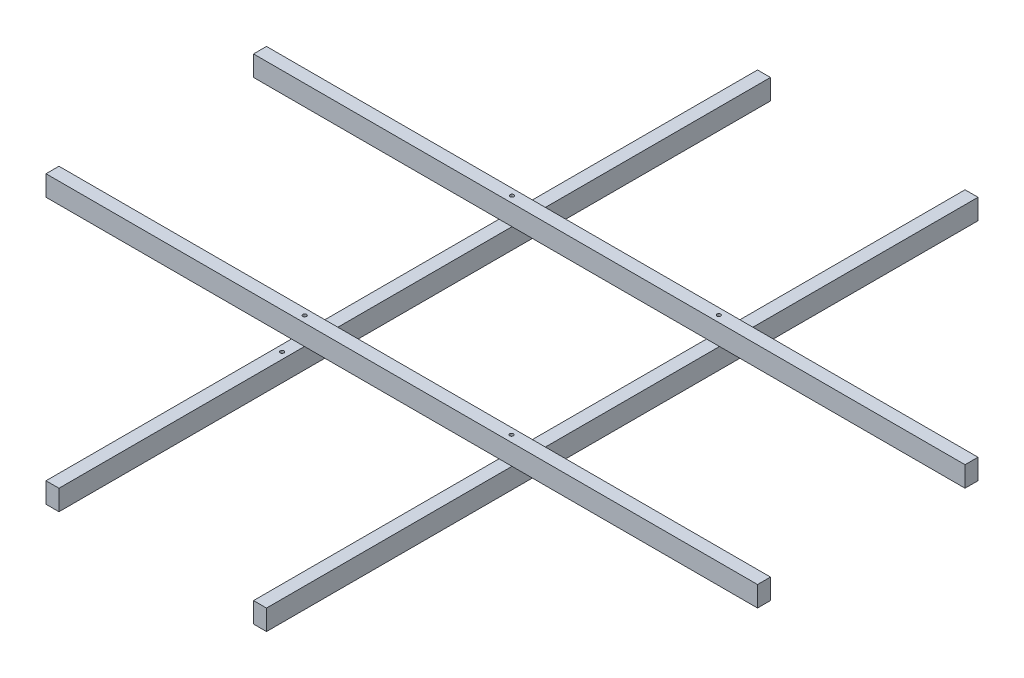
ISO-10303-21;
HEADER;
FILE_DESCRIPTION(('STEP AP214'),'2;1');
FILE_NAME('part.step','',(''),(''),'','','');
FILE_SCHEMA(('AUTOMOTIVE_DESIGN { 1 0 10303 214 1 1 1 1 }'));
ENDSEC;
DATA;
#1=APPLICATION_CONTEXT('core data for automotive mechanical design processes');
#2=APPLICATION_PROTOCOL_DEFINITION('international standard','automotive_design',2000,#1);
#3=PRODUCT_CONTEXT('',#1,'mechanical');
#4=PRODUCT('Part','Part','',(#3));
#5=PRODUCT_RELATED_PRODUCT_CATEGORY('part','',(#4));
#6=PRODUCT_DEFINITION_FORMATION('','',#4);
#7=PRODUCT_DEFINITION_CONTEXT('part definition',#1,'design');
#8=PRODUCT_DEFINITION('design','',#6,#7);
#9=PRODUCT_DEFINITION_SHAPE('','',#8);
#10=(LENGTH_UNIT() NAMED_UNIT(*) SI_UNIT(.MILLI.,.METRE.));
#11=(NAMED_UNIT(*) PLANE_ANGLE_UNIT() SI_UNIT($,.RADIAN.));
#12=(NAMED_UNIT(*) SI_UNIT($,.STERADIAN.) SOLID_ANGLE_UNIT());
#13=UNCERTAINTY_MEASURE_WITH_UNIT(LENGTH_MEASURE(1.E-05),#10,'distance_accuracy_value','');
#14=(GEOMETRIC_REPRESENTATION_CONTEXT(3) GLOBAL_UNCERTAINTY_ASSIGNED_CONTEXT((#13)) GLOBAL_UNIT_ASSIGNED_CONTEXT((#10,
#11,#12)) REPRESENTATION_CONTEXT('',''));
#15=CARTESIAN_POINT('',(0.,0.,0.));
#16=DIRECTION('',(0.,0.,1.));
#17=DIRECTION('',(1.,0.,0.));
#18=AXIS2_PLACEMENT_3D('',#15,#16,#17);
#19=CARTESIAN_POINT('',(4572.,209.55,-1771.65));
#20=DIRECTION('',(0.,0.,1.));
#21=DIRECTION('',(0.,-1.,0.));
#22=AXIS2_PLACEMENT_3D('',#19,#20,#21);
#23=PLANE('',#22);
#24=DIRECTION('',(0.,1.,0.));
#25=VECTOR('',#24,1.);
#26=CARTESIAN_POINT('',(-304.8,209.55,-1771.65));
#27=LINE('',#26,#25);
#28=CARTESIAN_POINT('',(-304.8,69.85,-1771.65));
#29=VERTEX_POINT('',#28);
#30=CARTESIAN_POINT('',(-304.8,209.55,-1771.65));
#31=VERTEX_POINT('',#30);
#32=EDGE_CURVE('E135',#29,#31,#27,.T.);
#33=ORIENTED_EDGE('',*,*,#32,.T.);
#34=DIRECTION('',(-1.,0.,0.));
#35=VECTOR('',#34,1.);
#36=CARTESIAN_POINT('',(4572.,209.55,-1771.65));
#37=LINE('',#36,#35);
#38=CARTESIAN_POINT('',(4572.,209.55,-1771.65));
#39=VERTEX_POINT('',#38);
#40=EDGE_CURVE('E13',#39,#31,#37,.T.);
#41=ORIENTED_EDGE('',*,*,#40,.F.);
#42=DIRECTION('',(0.,1.,0.));
#43=VECTOR('',#42,1.);
#44=CARTESIAN_POINT('',(4572.,209.55,-1771.65));
#45=LINE('',#44,#43);
#46=CARTESIAN_POINT('',(4572.,69.85,-1771.65));
#47=VERTEX_POINT('',#46);
#48=EDGE_CURVE('E121',#47,#39,#45,.T.);
#49=ORIENTED_EDGE('',*,*,#48,.F.);
#50=DIRECTION('',(-1.,0.,0.));
#51=VECTOR('',#50,1.);
#52=CARTESIAN_POINT('',(4572.,69.85,-1771.65));
#53=LINE('',#52,#51);
#54=EDGE_CURVE('E131',#47,#29,#53,.T.);
#55=ORIENTED_EDGE('',*,*,#54,.T.);
#56=EDGE_LOOP('',(#33,#41,#49,#55));
#57=FACE_BOUND('',#56,.T.);
#58=ADVANCED_FACE('F67',(#57),#23,.F.);
#59=CARTESIAN_POINT('',(4572.,209.55,-1682.75));
#60=DIRECTION('',(0.,-1.,0.));
#61=DIRECTION('',(0.,0.,-1.));
#62=AXIS2_PLACEMENT_3D('',#59,#60,#61);
#63=PLANE('',#62);
#64=CARTESIAN_POINT('',(1422.4,209.55,-1728.39304116335));
#65=DIRECTION('',(0.,1.,0.));
#66=DIRECTION('',(0.,0.,1.));
#67=AXIS2_PLACEMENT_3D('',#64,#65,#66);
#68=CIRCLE('',#67,12.6999999999999);
#69=CARTESIAN_POINT('',(1422.4,209.55,-1715.69304116335));
#70=VERTEX_POINT('',#69);
#71=EDGE_CURVE('E147',#70,#70,#68,.T.);
#72=ORIENTED_EDGE('',*,*,#71,.F.);
#73=EDGE_LOOP('',(#72));
#74=FACE_BOUND('',#73,.T.);
#75=CARTESIAN_POINT('',(2840.25757753735,209.55,-1728.39304116335));
#76=DIRECTION('',(0.,1.,0.));
#77=DIRECTION('',(0.,0.,1.));
#78=AXIS2_PLACEMENT_3D('',#75,#76,#77);
#79=CIRCLE('',#78,12.7000000000003);
#80=CARTESIAN_POINT('',(2840.25757753735,209.55,-1715.69304116335));
#81=VERTEX_POINT('',#80);
#82=EDGE_CURVE('E152',#81,#81,#79,.T.);
#83=ORIENTED_EDGE('',*,*,#82,.F.);
#84=EDGE_LOOP('',(#83));
#85=FACE_BOUND('',#84,.T.);
#86=DIRECTION('',(0.,0.,1.));
#87=VECTOR('',#86,1.);
#88=CARTESIAN_POINT('',(-304.8,209.55,-1682.75));
#89=LINE('',#88,#87);
#90=CARTESIAN_POINT('',(-304.8,209.55,-1682.75));
#91=VERTEX_POINT('',#90);
#92=EDGE_CURVE('E125',#31,#91,#89,.T.);
#93=ORIENTED_EDGE('',*,*,#92,.T.);
#94=DIRECTION('',(-1.,0.,0.));
#95=VECTOR('',#94,1.);
#96=CARTESIAN_POINT('',(4572.,209.55,-1682.75));
#97=LINE('',#96,#95);
#98=CARTESIAN_POINT('',(4572.,209.55,-1682.75));
#99=VERTEX_POINT('',#98);
#100=EDGE_CURVE('E77',#99,#91,#97,.T.);
#101=ORIENTED_EDGE('',*,*,#100,.F.);
#102=DIRECTION('',(0.,0.,1.));
#103=VECTOR('',#102,1.);
#104=CARTESIAN_POINT('',(4572.,209.55,-1682.75));
#105=LINE('',#104,#103);
#106=EDGE_CURVE('E116',#39,#99,#105,.T.);
#107=ORIENTED_EDGE('',*,*,#106,.F.);
#108=ORIENTED_EDGE('',*,*,#40,.T.);
#109=EDGE_LOOP('',(#93,#101,#107,#108));
#110=FACE_BOUND('',#109,.T.);
#111=ADVANCED_FACE('F124',(#74,#85,#110),#63,.F.);
#112=CARTESIAN_POINT('',(4572.,209.55,-1682.75));
#113=DIRECTION('',(0.,0.,-1.));
#114=DIRECTION('',(0.,1.,0.));
#115=AXIS2_PLACEMENT_3D('',#112,#113,#114);
#116=PLANE('',#115);
#117=DIRECTION('',(0.,-1.,0.));
#118=VECTOR('',#117,1.);
#119=CARTESIAN_POINT('',(-304.8,209.55,-1682.75));
#120=LINE('',#119,#118);
#121=CARTESIAN_POINT('',(-304.8,69.85,-1682.75));
#122=VERTEX_POINT('',#121);
#123=EDGE_CURVE('E103',#91,#122,#120,.T.);
#124=ORIENTED_EDGE('',*,*,#123,.T.);
#125=DIRECTION('',(-1.,0.,0.));
#126=VECTOR('',#125,1.);
#127=CARTESIAN_POINT('',(4572.,69.85,-1682.75));
#128=LINE('',#127,#126);
#129=CARTESIAN_POINT('',(4572.,69.85,-1682.75));
#130=VERTEX_POINT('',#129);
#131=EDGE_CURVE('E127',#130,#122,#128,.T.);
#132=ORIENTED_EDGE('',*,*,#131,.F.);
#133=DIRECTION('',(0.,-1.,0.));
#134=VECTOR('',#133,1.);
#135=CARTESIAN_POINT('',(4572.,209.55,-1682.75));
#136=LINE('',#135,#134);
#137=EDGE_CURVE('E119',#99,#130,#136,.T.);
#138=ORIENTED_EDGE('',*,*,#137,.F.);
#139=ORIENTED_EDGE('',*,*,#100,.T.);
#140=EDGE_LOOP('',(#124,#132,#138,#139));
#141=FACE_BOUND('',#140,.T.);
#142=ADVANCED_FACE('F129',(#141),#116,.F.);
#143=CARTESIAN_POINT('',(4572.,69.85,-1682.75));
#144=DIRECTION('',(0.,1.,0.));
#145=DIRECTION('',(0.,0.,1.));
#146=AXIS2_PLACEMENT_3D('',#143,#144,#145);
#147=PLANE('',#146);
#148=CARTESIAN_POINT('',(1422.4,69.85,-1728.39304116335));
#149=DIRECTION('',(0.,1.,0.));
#150=DIRECTION('',(0.,0.,1.));
#151=AXIS2_PLACEMENT_3D('',#148,#149,#150);
#152=CIRCLE('',#151,12.6999999999999);
#153=CARTESIAN_POINT('',(1422.4,69.85,-1715.69304116335));
#154=VERTEX_POINT('',#153);
#155=EDGE_CURVE('E70',#154,#154,#152,.T.);
#156=ORIENTED_EDGE('',*,*,#155,.T.);
#157=EDGE_LOOP('',(#156));
#158=FACE_BOUND('',#157,.T.);
#159=CARTESIAN_POINT('',(2840.25757753735,69.85,-1728.39304116335));
#160=DIRECTION('',(0.,1.,0.));
#161=DIRECTION('',(0.,0.,1.));
#162=AXIS2_PLACEMENT_3D('',#159,#160,#161);
#163=CIRCLE('',#162,12.7000000000003);
#164=CARTESIAN_POINT('',(2840.25757753735,69.85,-1715.69304116335));
#165=VERTEX_POINT('',#164);
#166=EDGE_CURVE('E144',#165,#165,#163,.T.);
#167=ORIENTED_EDGE('',*,*,#166,.T.);
#168=EDGE_LOOP('',(#167));
#169=FACE_BOUND('',#168,.T.);
#170=DIRECTION('',(0.,0.,-1.));
#171=VECTOR('',#170,1.);
#172=CARTESIAN_POINT('',(-304.8,69.85,-1682.75));
#173=LINE('',#172,#171);
#174=EDGE_CURVE('E109',#122,#29,#173,.T.);
#175=ORIENTED_EDGE('',*,*,#174,.T.);
#176=ORIENTED_EDGE('',*,*,#54,.F.);
#177=DIRECTION('',(0.,0.,-1.));
#178=VECTOR('',#177,1.);
#179=CARTESIAN_POINT('',(4572.,69.85,-1682.75));
#180=LINE('',#179,#178);
#181=EDGE_CURVE('E86',#130,#47,#180,.T.);
#182=ORIENTED_EDGE('',*,*,#181,.F.);
#183=ORIENTED_EDGE('',*,*,#131,.T.);
#184=EDGE_LOOP('',(#175,#176,#182,#183));
#185=FACE_BOUND('',#184,.T.);
#186=ADVANCED_FACE('F171',(#158,#169,#185),#147,.F.);
#187=CARTESIAN_POINT('',(4572.,139.7,-3149.6));
#188=DIRECTION('',(1.,0.,0.));
#189=DIRECTION('',(0.,0.,-1.));
#190=AXIS2_PLACEMENT_3D('',#187,#188,#189);
#191=PLANE('',#190);
#192=ORIENTED_EDGE('',*,*,#48,.T.);
#193=ORIENTED_EDGE('',*,*,#106,.T.);
#194=ORIENTED_EDGE('',*,*,#137,.T.);
#195=ORIENTED_EDGE('',*,*,#181,.T.);
#196=EDGE_LOOP('',(#192,#193,#194,#195));
#197=FACE_BOUND('',#196,.T.);
#198=ADVANCED_FACE('F117',(#197),#191,.T.);
#199=CARTESIAN_POINT('',(-304.8,139.7,-3149.6));
#200=DIRECTION('',(1.,0.,0.));
#201=DIRECTION('',(0.,0.,-1.));
#202=AXIS2_PLACEMENT_3D('',#199,#200,#201);
#203=PLANE('',#202);
#204=ORIENTED_EDGE('',*,*,#32,.F.);
#205=ORIENTED_EDGE('',*,*,#174,.F.);
#206=ORIENTED_EDGE('',*,*,#123,.F.);
#207=ORIENTED_EDGE('',*,*,#92,.F.);
#208=EDGE_LOOP('',(#204,#205,#206,#207));
#209=FACE_BOUND('',#208,.T.);
#210=ADVANCED_FACE('F178',(#209),#203,.F.);
#211=CARTESIAN_POINT('',(2840.25757753735,-69.85,-1728.39304116335));
#212=DIRECTION('',(0.,1.,0.));
#213=DIRECTION('',(0.,0.,1.));
#214=AXIS2_PLACEMENT_3D('',#211,#212,#213);
#215=CYLINDRICAL_SURFACE('',#214,12.7000000000003);
#216=ORIENTED_EDGE('',*,*,#82,.T.);
#217=EDGE_LOOP('',(#216));
#218=FACE_BOUND('',#217,.T.);
#219=ORIENTED_EDGE('',*,*,#166,.F.);
#220=EDGE_LOOP('',(#219));
#221=FACE_BOUND('',#220,.T.);
#222=ADVANCED_FACE('F161',(#218,#221),#215,.F.);
#223=CARTESIAN_POINT('',(1422.4,-69.85,-1728.39304116335));
#224=DIRECTION('',(0.,1.,0.));
#225=DIRECTION('',(0.,0.,1.));
#226=AXIS2_PLACEMENT_3D('',#223,#224,#225);
#227=CYLINDRICAL_SURFACE('',#226,12.6999999999999);
#228=ORIENTED_EDGE('',*,*,#71,.T.);
#229=EDGE_LOOP('',(#228));
#230=FACE_BOUND('',#229,.T.);
#231=ORIENTED_EDGE('',*,*,#155,.F.);
#232=EDGE_LOOP('',(#231));
#233=FACE_BOUND('',#232,.T.);
#234=ADVANCED_FACE('F186',(#230,#233),#227,.F.);
#235=CLOSED_SHELL('',(#58,#111,#142,#186,#198,#210,#222,#234));
#236=MANIFOLD_SOLID_BREP('B2',#235);
#237=CARTESIAN_POINT('',(4572.,209.55,-3194.05));
#238=DIRECTION('',(0.,0.,1.));
#239=DIRECTION('',(0.,-1.,0.));
#240=AXIS2_PLACEMENT_3D('',#237,#238,#239);
#241=PLANE('',#240);
#242=DIRECTION('',(0.,1.,0.));
#243=VECTOR('',#242,1.);
#244=CARTESIAN_POINT('',(-304.8,209.55,-3194.05));
#245=LINE('',#244,#243);
#246=CARTESIAN_POINT('',(-304.8,69.85,-3194.05));
#247=VERTEX_POINT('',#246);
#248=CARTESIAN_POINT('',(-304.8,209.55,-3194.05));
#249=VERTEX_POINT('',#248);
#250=EDGE_CURVE('E344',#247,#249,#245,.T.);
#251=ORIENTED_EDGE('',*,*,#250,.T.);
#252=DIRECTION('',(-1.,0.,0.));
#253=VECTOR('',#252,1.);
#254=CARTESIAN_POINT('',(4572.,209.55,-3194.05));
#255=LINE('',#254,#253);
#256=CARTESIAN_POINT('',(4572.,209.55,-3194.05));
#257=VERTEX_POINT('',#256);
#258=EDGE_CURVE('E65',#257,#249,#255,.T.);
#259=ORIENTED_EDGE('',*,*,#258,.F.);
#260=DIRECTION('',(0.,1.,0.));
#261=VECTOR('',#260,1.);
#262=CARTESIAN_POINT('',(4572.,209.55,-3194.05));
#263=LINE('',#262,#261);
#264=CARTESIAN_POINT('',(4572.,69.85,-3194.05));
#265=VERTEX_POINT('',#264);
#266=EDGE_CURVE('E330',#265,#257,#263,.T.);
#267=ORIENTED_EDGE('',*,*,#266,.F.);
#268=DIRECTION('',(-1.,0.,0.));
#269=VECTOR('',#268,1.);
#270=CARTESIAN_POINT('',(4572.,69.85,-3194.05));
#271=LINE('',#270,#269);
#272=EDGE_CURVE('E340',#265,#247,#271,.T.);
#273=ORIENTED_EDGE('',*,*,#272,.T.);
#274=EDGE_LOOP('',(#251,#259,#267,#273));
#275=FACE_BOUND('',#274,.T.);
#276=ADVANCED_FACE('F276',(#275),#241,.F.);
#277=CARTESIAN_POINT('',(4572.,209.55,-3105.15));
#278=DIRECTION('',(0.,-1.,0.));
#279=DIRECTION('',(0.,0.,-1.));
#280=AXIS2_PLACEMENT_3D('',#277,#278,#279);
#281=PLANE('',#280);
#282=CARTESIAN_POINT('',(1422.4,209.55,-3149.6));
#283=DIRECTION('',(0.,1.,0.));
#284=DIRECTION('',(0.,0.,1.));
#285=AXIS2_PLACEMENT_3D('',#282,#283,#284);
#286=CIRCLE('',#285,12.6999999999999);
#287=CARTESIAN_POINT('',(1422.4,209.55,-3136.9));
#288=VERTEX_POINT('',#287);
#289=EDGE_CURVE('E355',#288,#288,#286,.T.);
#290=ORIENTED_EDGE('',*,*,#289,.F.);
#291=EDGE_LOOP('',(#290));
#292=FACE_BOUND('',#291,.T.);
#293=CARTESIAN_POINT('',(2840.25757753735,209.55,-3149.6));
#294=DIRECTION('',(0.,1.,0.));
#295=DIRECTION('',(0.,0.,1.));
#296=AXIS2_PLACEMENT_3D('',#293,#294,#295);
#297=CIRCLE('',#296,12.7000000000003);
#298=CARTESIAN_POINT('',(2840.25757753735,209.55,-3136.9));
#299=VERTEX_POINT('',#298);
#300=EDGE_CURVE('E360',#299,#299,#297,.T.);
#301=ORIENTED_EDGE('',*,*,#300,.F.);
#302=EDGE_LOOP('',(#301));
#303=FACE_BOUND('',#302,.T.);
#304=DIRECTION('',(0.,0.,1.));
#305=VECTOR('',#304,1.);
#306=CARTESIAN_POINT('',(-304.8,209.55,-3105.15));
#307=LINE('',#306,#305);
#308=CARTESIAN_POINT('',(-304.8,209.55,-3105.15));
#309=VERTEX_POINT('',#308);
#310=EDGE_CURVE('E334',#249,#309,#307,.T.);
#311=ORIENTED_EDGE('',*,*,#310,.T.);
#312=DIRECTION('',(-1.,0.,0.));
#313=VECTOR('',#312,1.);
#314=CARTESIAN_POINT('',(4572.,209.55,-3105.15));
#315=LINE('',#314,#313);
#316=CARTESIAN_POINT('',(4572.,209.55,-3105.15));
#317=VERTEX_POINT('',#316);
#318=EDGE_CURVE('E286',#317,#309,#315,.T.);
#319=ORIENTED_EDGE('',*,*,#318,.F.);
#320=DIRECTION('',(0.,0.,1.));
#321=VECTOR('',#320,1.);
#322=CARTESIAN_POINT('',(4572.,209.55,-3105.15));
#323=LINE('',#322,#321);
#324=EDGE_CURVE('E325',#257,#317,#323,.T.);
#325=ORIENTED_EDGE('',*,*,#324,.F.);
#326=ORIENTED_EDGE('',*,*,#258,.T.);
#327=EDGE_LOOP('',(#311,#319,#325,#326));
#328=FACE_BOUND('',#327,.T.);
#329=ADVANCED_FACE('F333',(#292,#303,#328),#281,.F.);
#330=CARTESIAN_POINT('',(4572.,209.55,-3105.15));
#331=DIRECTION('',(0.,0.,-1.));
#332=DIRECTION('',(0.,1.,0.));
#333=AXIS2_PLACEMENT_3D('',#330,#331,#332);
#334=PLANE('',#333);
#335=DIRECTION('',(0.,-1.,0.));
#336=VECTOR('',#335,1.);
#337=CARTESIAN_POINT('',(-304.8,209.55,-3105.15));
#338=LINE('',#337,#336);
#339=CARTESIAN_POINT('',(-304.8,69.85,-3105.15));
#340=VERTEX_POINT('',#339);
#341=EDGE_CURVE('E312',#309,#340,#338,.T.);
#342=ORIENTED_EDGE('',*,*,#341,.T.);
#343=DIRECTION('',(-1.,0.,0.));
#344=VECTOR('',#343,1.);
#345=CARTESIAN_POINT('',(4572.,69.85,-3105.15));
#346=LINE('',#345,#344);
#347=CARTESIAN_POINT('',(4572.,69.85,-3105.15));
#348=VERTEX_POINT('',#347);
#349=EDGE_CURVE('E336',#348,#340,#346,.T.);
#350=ORIENTED_EDGE('',*,*,#349,.F.);
#351=DIRECTION('',(0.,-1.,0.));
#352=VECTOR('',#351,1.);
#353=CARTESIAN_POINT('',(4572.,209.55,-3105.15));
#354=LINE('',#353,#352);
#355=EDGE_CURVE('E328',#317,#348,#354,.T.);
#356=ORIENTED_EDGE('',*,*,#355,.F.);
#357=ORIENTED_EDGE('',*,*,#318,.T.);
#358=EDGE_LOOP('',(#342,#350,#356,#357));
#359=FACE_BOUND('',#358,.T.);
#360=ADVANCED_FACE('F338',(#359),#334,.F.);
#361=CARTESIAN_POINT('',(4572.,69.85,-3105.15));
#362=DIRECTION('',(0.,1.,0.));
#363=DIRECTION('',(0.,0.,1.));
#364=AXIS2_PLACEMENT_3D('',#361,#362,#363);
#365=PLANE('',#364);
#366=CARTESIAN_POINT('',(1422.4,69.85,-3149.6));
#367=DIRECTION('',(0.,1.,0.));
#368=DIRECTION('',(0.,0.,1.));
#369=AXIS2_PLACEMENT_3D('',#366,#367,#368);
#370=CIRCLE('',#369,12.6999999999999);
#371=CARTESIAN_POINT('',(1422.4,69.85,-3136.9));
#372=VERTEX_POINT('',#371);
#373=EDGE_CURVE('E279',#372,#372,#370,.T.);
#374=ORIENTED_EDGE('',*,*,#373,.T.);
#375=EDGE_LOOP('',(#374));
#376=FACE_BOUND('',#375,.T.);
#377=CARTESIAN_POINT('',(2840.25757753735,69.85,-3149.6));
#378=DIRECTION('',(0.,1.,0.));
#379=DIRECTION('',(0.,0.,1.));
#380=AXIS2_PLACEMENT_3D('',#377,#378,#379);
#381=CIRCLE('',#380,12.7000000000003);
#382=CARTESIAN_POINT('',(2840.25757753735,69.85,-3136.9));
#383=VERTEX_POINT('',#382);
#384=EDGE_CURVE('E353',#383,#383,#381,.T.);
#385=ORIENTED_EDGE('',*,*,#384,.T.);
#386=EDGE_LOOP('',(#385));
#387=FACE_BOUND('',#386,.T.);
#388=DIRECTION('',(0.,0.,-1.));
#389=VECTOR('',#388,1.);
#390=CARTESIAN_POINT('',(-304.8,69.85,-3105.15));
#391=LINE('',#390,#389);
#392=EDGE_CURVE('E318',#340,#247,#391,.T.);
#393=ORIENTED_EDGE('',*,*,#392,.T.);
#394=ORIENTED_EDGE('',*,*,#272,.F.);
#395=DIRECTION('',(0.,0.,-1.));
#396=VECTOR('',#395,1.);
#397=CARTESIAN_POINT('',(4572.,69.85,-3105.15));
#398=LINE('',#397,#396);
#399=EDGE_CURVE('E295',#348,#265,#398,.T.);
#400=ORIENTED_EDGE('',*,*,#399,.F.);
#401=ORIENTED_EDGE('',*,*,#349,.T.);
#402=EDGE_LOOP('',(#393,#394,#400,#401));
#403=FACE_BOUND('',#402,.T.);
#404=ADVANCED_FACE('F378',(#376,#387,#403),#365,.F.);
#405=CARTESIAN_POINT('',(4572.,139.7,-4572.));
#406=DIRECTION('',(1.,0.,0.));
#407=DIRECTION('',(0.,0.,-1.));
#408=AXIS2_PLACEMENT_3D('',#405,#406,#407);
#409=PLANE('',#408);
#410=ORIENTED_EDGE('',*,*,#266,.T.);
#411=ORIENTED_EDGE('',*,*,#324,.T.);
#412=ORIENTED_EDGE('',*,*,#355,.T.);
#413=ORIENTED_EDGE('',*,*,#399,.T.);
#414=EDGE_LOOP('',(#410,#411,#412,#413));
#415=FACE_BOUND('',#414,.T.);
#416=ADVANCED_FACE('F326',(#415),#409,.T.);
#417=CARTESIAN_POINT('',(-304.8,139.7,-4572.));
#418=DIRECTION('',(1.,0.,0.));
#419=DIRECTION('',(0.,0.,-1.));
#420=AXIS2_PLACEMENT_3D('',#417,#418,#419);
#421=PLANE('',#420);
#422=ORIENTED_EDGE('',*,*,#250,.F.);
#423=ORIENTED_EDGE('',*,*,#392,.F.);
#424=ORIENTED_EDGE('',*,*,#341,.F.);
#425=ORIENTED_EDGE('',*,*,#310,.F.);
#426=EDGE_LOOP('',(#422,#423,#424,#425));
#427=FACE_BOUND('',#426,.T.);
#428=ADVANCED_FACE('F385',(#427),#421,.F.);
#429=CARTESIAN_POINT('',(2840.25757753735,-69.85,-3149.6));
#430=DIRECTION('',(0.,1.,0.));
#431=DIRECTION('',(0.,0.,1.));
#432=AXIS2_PLACEMENT_3D('',#429,#430,#431);
#433=CYLINDRICAL_SURFACE('',#432,12.7000000000003);
#434=ORIENTED_EDGE('',*,*,#300,.T.);
#435=EDGE_LOOP('',(#434));
#436=FACE_BOUND('',#435,.T.);
#437=ORIENTED_EDGE('',*,*,#384,.F.);
#438=EDGE_LOOP('',(#437));
#439=FACE_BOUND('',#438,.T.);
#440=ADVANCED_FACE('F368',(#436,#439),#433,.F.);
#441=CARTESIAN_POINT('',(1422.4,-69.85,-3149.6));
#442=DIRECTION('',(0.,1.,0.));
#443=DIRECTION('',(0.,0.,1.));
#444=AXIS2_PLACEMENT_3D('',#441,#442,#443);
#445=CYLINDRICAL_SURFACE('',#444,12.6999999999999);
#446=ORIENTED_EDGE('',*,*,#289,.T.);
#447=EDGE_LOOP('',(#446));
#448=FACE_BOUND('',#447,.T.);
#449=ORIENTED_EDGE('',*,*,#373,.F.);
#450=EDGE_LOOP('',(#449));
#451=FACE_BOUND('',#450,.T.);
#452=ADVANCED_FACE('F393',(#448,#451),#445,.F.);
#453=CLOSED_SHELL('',(#276,#329,#360,#404,#416,#428,#440,#452));
#454=MANIFOLD_SOLID_BREP('B7',#453);
#455=CARTESIAN_POINT('',(2800.35,69.85,-4876.8));
#456=DIRECTION('',(1.,0.,0.));
#457=DIRECTION('',(0.,1.,0.));
#458=AXIS2_PLACEMENT_3D('',#455,#456,#457);
#459=PLANE('',#458);
#460=DIRECTION('',(0.,1.,0.));
#461=VECTOR('',#460,1.);
#462=CARTESIAN_POINT('',(2800.35,69.85,2.61290641066079E-13));
#463=LINE('',#462,#461);
#464=CARTESIAN_POINT('',(2800.35,-69.85,2.61290641066079E-13));
#465=VERTEX_POINT('',#464);
#466=CARTESIAN_POINT('',(2800.35,69.85,2.61290641066079E-13));
#467=VERTEX_POINT('',#466);
#468=EDGE_CURVE('E547',#465,#467,#463,.T.);
#469=ORIENTED_EDGE('',*,*,#468,.T.);
#470=DIRECTION('',(0.,0.,1.));
#471=VECTOR('',#470,1.);
#472=CARTESIAN_POINT('',(2800.35,69.85,-4876.8));
#473=LINE('',#472,#471);
#474=CARTESIAN_POINT('',(2800.35,69.85,-4876.8));
#475=VERTEX_POINT('',#474);
#476=EDGE_CURVE('E274',#475,#467,#473,.T.);
#477=ORIENTED_EDGE('',*,*,#476,.F.);
#478=DIRECTION('',(0.,1.,0.));
#479=VECTOR('',#478,1.);
#480=CARTESIAN_POINT('',(2800.35,69.85,-4876.8));
#481=LINE('',#480,#479);
#482=CARTESIAN_POINT('',(2800.35,-69.85,-4876.8));
#483=VERTEX_POINT('',#482);
#484=EDGE_CURVE('E534',#483,#475,#481,.T.);
#485=ORIENTED_EDGE('',*,*,#484,.F.);
#486=DIRECTION('',(0.,0.,1.));
#487=VECTOR('',#486,1.);
#488=CARTESIAN_POINT('',(2800.35,-69.85,-4876.8));
#489=LINE('',#488,#487);
#490=EDGE_CURVE('E543',#483,#465,#489,.T.);
#491=ORIENTED_EDGE('',*,*,#490,.T.);
#492=EDGE_LOOP('',(#469,#477,#485,#491));
#493=FACE_BOUND('',#492,.T.);
#494=ADVANCED_FACE('F482',(#493),#459,.F.);
#495=CARTESIAN_POINT('',(2889.25,69.85,-4876.8));
#496=DIRECTION('',(0.,-1.,0.));
#497=DIRECTION('',(0.,0.,-1.));
#498=AXIS2_PLACEMENT_3D('',#495,#496,#497);
#499=PLANE('',#498);
#500=CARTESIAN_POINT('',(2840.25757753735,69.85,-3149.6));
#501=DIRECTION('',(0.,-1.,0.));
#502=DIRECTION('',(0.,0.,-1.));
#503=AXIS2_PLACEMENT_3D('',#500,#501,#502);
#504=CIRCLE('',#503,12.7000000000003);
#505=CARTESIAN_POINT('',(2840.25757753735,69.85,-3162.3));
#506=VERTEX_POINT('',#505);
#507=EDGE_CURVE('E550',#506,#506,#504,.T.);
#508=ORIENTED_EDGE('',*,*,#507,.T.);
#509=EDGE_LOOP('',(#508));
#510=FACE_BOUND('',#509,.T.);
#511=CARTESIAN_POINT('',(2840.25757753735,69.85,-1728.39304116335));
#512=DIRECTION('',(0.,-1.,0.));
#513=DIRECTION('',(0.,0.,-1.));
#514=AXIS2_PLACEMENT_3D('',#511,#512,#513);
#515=CIRCLE('',#514,12.7000000000003);
#516=CARTESIAN_POINT('',(2840.25757753735,69.85,-1741.09304116335));
#517=VERTEX_POINT('',#516);
#518=EDGE_CURVE('E565',#517,#517,#515,.T.);
#519=ORIENTED_EDGE('',*,*,#518,.T.);
#520=EDGE_LOOP('',(#519));
#521=FACE_BOUND('',#520,.T.);
#522=DIRECTION('',(1.,0.,0.));
#523=VECTOR('',#522,1.);
#524=CARTESIAN_POINT('',(2889.25,69.85,2.61290641066079E-13));
#525=LINE('',#524,#523);
#526=CARTESIAN_POINT('',(2889.25,69.85,2.61290641066079E-13));
#527=VERTEX_POINT('',#526);
#528=EDGE_CURVE('E538',#467,#527,#525,.T.);
#529=ORIENTED_EDGE('',*,*,#528,.T.);
#530=DIRECTION('',(0.,0.,1.));
#531=VECTOR('',#530,1.);
#532=CARTESIAN_POINT('',(2889.25,69.85,-4876.8));
#533=LINE('',#532,#531);
#534=CARTESIAN_POINT('',(2889.25,69.85,-4876.8));
#535=VERTEX_POINT('',#534);
#536=EDGE_CURVE('E491',#535,#527,#533,.T.);
#537=ORIENTED_EDGE('',*,*,#536,.F.);
#538=DIRECTION('',(1.,0.,0.));
#539=VECTOR('',#538,1.);
#540=CARTESIAN_POINT('',(2889.25,69.85,-4876.8));
#541=LINE('',#540,#539);
#542=EDGE_CURVE('E529',#475,#535,#541,.T.);
#543=ORIENTED_EDGE('',*,*,#542,.F.);
#544=ORIENTED_EDGE('',*,*,#476,.T.);
#545=EDGE_LOOP('',(#529,#537,#543,#544));
#546=FACE_BOUND('',#545,.T.);
#547=ADVANCED_FACE('F537',(#510,#521,#546),#499,.F.);
#548=CARTESIAN_POINT('',(2889.25,69.85,-4876.8));
#549=DIRECTION('',(-1.,0.,0.));
#550=DIRECTION('',(0.,-1.,0.));
#551=AXIS2_PLACEMENT_3D('',#548,#549,#550);
#552=PLANE('',#551);
#553=DIRECTION('',(0.,-1.,0.));
#554=VECTOR('',#553,1.);
#555=CARTESIAN_POINT('',(2889.25,69.85,2.61290641066079E-13));
#556=LINE('',#555,#554);
#557=CARTESIAN_POINT('',(2889.25,-69.85,2.61290641066079E-13));
#558=VERTEX_POINT('',#557);
#559=EDGE_CURVE('E516',#527,#558,#556,.T.);
#560=ORIENTED_EDGE('',*,*,#559,.T.);
#561=DIRECTION('',(0.,0.,1.));
#562=VECTOR('',#561,1.);
#563=CARTESIAN_POINT('',(2889.25,-69.85,-4876.8));
#564=LINE('',#563,#562);
#565=CARTESIAN_POINT('',(2889.25,-69.85,-4876.8));
#566=VERTEX_POINT('',#565);
#567=EDGE_CURVE('E540',#566,#558,#564,.T.);
#568=ORIENTED_EDGE('',*,*,#567,.F.);
#569=DIRECTION('',(0.,-1.,0.));
#570=VECTOR('',#569,1.);
#571=CARTESIAN_POINT('',(2889.25,69.85,-4876.8));
#572=LINE('',#571,#570);
#573=EDGE_CURVE('E532',#535,#566,#572,.T.);
#574=ORIENTED_EDGE('',*,*,#573,.F.);
#575=ORIENTED_EDGE('',*,*,#536,.T.);
#576=EDGE_LOOP('',(#560,#568,#574,#575));
#577=FACE_BOUND('',#576,.T.);
#578=ADVANCED_FACE('F541',(#577),#552,.F.);
#579=CARTESIAN_POINT('',(2889.25,-69.85,-4876.8));
#580=DIRECTION('',(0.,1.,0.));
#581=DIRECTION('',(0.,0.,1.));
#582=AXIS2_PLACEMENT_3D('',#579,#580,#581);
#583=PLANE('',#582);
#584=CARTESIAN_POINT('',(2840.25757753735,-69.85,-3149.6));
#585=DIRECTION('',(0.,1.,0.));
#586=DIRECTION('',(0.,0.,1.));
#587=AXIS2_PLACEMENT_3D('',#584,#585,#586);
#588=CIRCLE('',#587,12.7000000000003);
#589=CARTESIAN_POINT('',(2840.25757753735,-69.85,-3136.9));
#590=VERTEX_POINT('',#589);
#591=EDGE_CURVE('E569',#590,#590,#588,.T.);
#592=ORIENTED_EDGE('',*,*,#591,.T.);
#593=EDGE_LOOP('',(#592));
#594=FACE_BOUND('',#593,.T.);
#595=CARTESIAN_POINT('',(2840.25757753735,-69.85,-1728.39304116335));
#596=DIRECTION('',(0.,1.,0.));
#597=DIRECTION('',(0.,0.,1.));
#598=AXIS2_PLACEMENT_3D('',#595,#596,#597);
#599=CIRCLE('',#598,12.7000000000003);
#600=CARTESIAN_POINT('',(2840.25757753735,-69.85,-1715.69304116335));
#601=VERTEX_POINT('',#600);
#602=EDGE_CURVE('E570',#601,#601,#599,.T.);
#603=ORIENTED_EDGE('',*,*,#602,.T.);
#604=EDGE_LOOP('',(#603));
#605=FACE_BOUND('',#604,.T.);
#606=DIRECTION('',(-1.,0.,0.));
#607=VECTOR('',#606,1.);
#608=CARTESIAN_POINT('',(2889.25,-69.85,2.61290641066079E-13));
#609=LINE('',#608,#607);
#610=EDGE_CURVE('E522',#558,#465,#609,.T.);
#611=ORIENTED_EDGE('',*,*,#610,.T.);
#612=ORIENTED_EDGE('',*,*,#490,.F.);
#613=DIRECTION('',(-1.,0.,0.));
#614=VECTOR('',#613,1.);
#615=CARTESIAN_POINT('',(2889.25,-69.85,-4876.8));
#616=LINE('',#615,#614);
#617=EDGE_CURVE('E499',#566,#483,#616,.T.);
#618=ORIENTED_EDGE('',*,*,#617,.F.);
#619=ORIENTED_EDGE('',*,*,#567,.T.);
#620=EDGE_LOOP('',(#611,#612,#618,#619));
#621=FACE_BOUND('',#620,.T.);
#622=ADVANCED_FACE('F557',(#594,#605,#621),#583,.F.);
#623=CARTESIAN_POINT('',(1422.4,0.,-4876.8));
#624=DIRECTION('',(0.,0.,-1.));
#625=DIRECTION('',(-1.,0.,0.));
#626=AXIS2_PLACEMENT_3D('',#623,#624,#625);
#627=PLANE('',#626);
#628=ORIENTED_EDGE('',*,*,#484,.T.);
#629=ORIENTED_EDGE('',*,*,#542,.T.);
#630=ORIENTED_EDGE('',*,*,#573,.T.);
#631=ORIENTED_EDGE('',*,*,#617,.T.);
#632=EDGE_LOOP('',(#628,#629,#630,#631));
#633=FACE_BOUND('',#632,.T.);
#634=ADVANCED_FACE('F530',(#633),#627,.T.);
#635=CARTESIAN_POINT('',(1422.4,0.,2.61290641066079E-13));
#636=DIRECTION('',(0.,0.,-1.));
#637=DIRECTION('',(-1.,0.,0.));
#638=AXIS2_PLACEMENT_3D('',#635,#636,#637);
#639=PLANE('',#638);
#640=ORIENTED_EDGE('',*,*,#468,.F.);
#641=ORIENTED_EDGE('',*,*,#610,.F.);
#642=ORIENTED_EDGE('',*,*,#559,.F.);
#643=ORIENTED_EDGE('',*,*,#528,.F.);
#644=EDGE_LOOP('',(#640,#641,#642,#643));
#645=FACE_BOUND('',#644,.T.);
#646=ADVANCED_FACE('F560',(#645),#639,.F.);
#647=CARTESIAN_POINT('',(2840.25757753735,-69.85,-1728.39304116335));
#648=DIRECTION('',(0.,1.,0.));
#649=DIRECTION('',(0.,0.,1.));
#650=AXIS2_PLACEMENT_3D('',#647,#648,#649);
#651=CYLINDRICAL_SURFACE('',#650,12.7000000000003);
#652=ORIENTED_EDGE('',*,*,#602,.F.);
#653=EDGE_LOOP('',(#652));
#654=FACE_BOUND('',#653,.T.);
#655=ORIENTED_EDGE('',*,*,#518,.F.);
#656=EDGE_LOOP('',(#655));
#657=FACE_BOUND('',#656,.T.);
#658=ADVANCED_FACE('F581',(#654,#657),#651,.F.);
#659=CARTESIAN_POINT('',(2840.25757753735,-69.85,-3149.6));
#660=DIRECTION('',(0.,1.,0.));
#661=DIRECTION('',(0.,0.,1.));
#662=AXIS2_PLACEMENT_3D('',#659,#660,#661);
#663=CYLINDRICAL_SURFACE('',#662,12.7000000000003);
#664=ORIENTED_EDGE('',*,*,#591,.F.);
#665=EDGE_LOOP('',(#664));
#666=FACE_BOUND('',#665,.T.);
#667=ORIENTED_EDGE('',*,*,#507,.F.);
#668=EDGE_LOOP('',(#667));
#669=FACE_BOUND('',#668,.T.);
#670=ADVANCED_FACE('F578',(#666,#669),#663,.F.);
#671=CLOSED_SHELL('',(#494,#547,#578,#622,#634,#646,#658,#670));
#672=MANIFOLD_SOLID_BREP('B59',#671);
#673=CARTESIAN_POINT('',(1377.95,69.85,-4876.8));
#674=DIRECTION('',(1.,0.,0.));
#675=DIRECTION('',(0.,1.,0.));
#676=AXIS2_PLACEMENT_3D('',#673,#674,#675);
#677=PLANE('',#676);
#678=DIRECTION('',(0.,1.,0.));
#679=VECTOR('',#678,1.);
#680=CARTESIAN_POINT('',(1377.95,69.85,8.88178419700125E-13));
#681=LINE('',#680,#679);
#682=CARTESIAN_POINT('',(1377.95,-69.85,8.88178419700125E-13));
#683=VERTEX_POINT('',#682);
#684=CARTESIAN_POINT('',(1377.95,69.85,8.88178419700125E-13));
#685=VERTEX_POINT('',#684);
#686=EDGE_CURVE('E744',#683,#685,#681,.T.);
#687=ORIENTED_EDGE('',*,*,#686,.T.);
#688=DIRECTION('',(0.,0.,1.));
#689=VECTOR('',#688,1.);
#690=CARTESIAN_POINT('',(1377.95,69.85,-4876.8));
#691=LINE('',#690,#689);
#692=CARTESIAN_POINT('',(1377.95,69.85,-4876.8));
#693=VERTEX_POINT('',#692);
#694=EDGE_CURVE('E480',#693,#685,#691,.T.);
#695=ORIENTED_EDGE('',*,*,#694,.F.);
#696=DIRECTION('',(0.,1.,0.));
#697=VECTOR('',#696,1.);
#698=CARTESIAN_POINT('',(1377.95,69.85,-4876.8));
#699=LINE('',#698,#697);
#700=CARTESIAN_POINT('',(1377.95,-69.85,-4876.8));
#701=VERTEX_POINT('',#700);
#702=EDGE_CURVE('E731',#701,#693,#699,.T.);
#703=ORIENTED_EDGE('',*,*,#702,.F.);
#704=DIRECTION('',(0.,0.,1.));
#705=VECTOR('',#704,1.);
#706=CARTESIAN_POINT('',(1377.95,-69.85,-4876.8));
#707=LINE('',#706,#705);
#708=EDGE_CURVE('E740',#701,#683,#707,.T.);
#709=ORIENTED_EDGE('',*,*,#708,.T.);
#710=EDGE_LOOP('',(#687,#695,#703,#709));
#711=FACE_BOUND('',#710,.T.);
#712=ADVANCED_FACE('F680',(#711),#677,.F.);
#713=CARTESIAN_POINT('',(1466.85,69.85,-4876.8));
#714=DIRECTION('',(0.,-1.,0.));
#715=DIRECTION('',(0.,0.,-1.));
#716=AXIS2_PLACEMENT_3D('',#713,#714,#715);
#717=PLANE('',#716);
#718=CARTESIAN_POINT('',(1422.19609917008,69.85,-1574.26171240823));
#719=DIRECTION('',(0.,1.,0.));
#720=DIRECTION('',(-1.,0.,0.));
#721=AXIS2_PLACEMENT_3D('',#718,#719,#720);
#722=CIRCLE('',#721,12.6999999999999);
#723=CARTESIAN_POINT('',(1409.49609917008,69.85,-1574.26171240823));
#724=VERTEX_POINT('',#723);
#725=EDGE_CURVE('E777',#724,#724,#722,.T.);
#726=ORIENTED_EDGE('',*,*,#725,.F.);
#727=EDGE_LOOP('',(#726));
#728=FACE_BOUND('',#727,.T.);
#729=CARTESIAN_POINT('',(1422.19609917008,69.85,-3186.47458694767));
#730=DIRECTION('',(0.,1.,0.));
#731=DIRECTION('',(-1.,0.,0.));
#732=AXIS2_PLACEMENT_3D('',#729,#730,#731);
#733=CIRCLE('',#732,12.6999999999999);
#734=CARTESIAN_POINT('',(1409.49609917008,69.85,-3186.47458694767));
#735=VERTEX_POINT('',#734);
#736=EDGE_CURVE('E774',#735,#735,#733,.T.);
#737=ORIENTED_EDGE('',*,*,#736,.F.);
#738=EDGE_LOOP('',(#737));
#739=FACE_BOUND('',#738,.T.);
#740=CARTESIAN_POINT('',(1422.4,69.85,-3149.6));
#741=DIRECTION('',(0.,-1.,0.));
#742=DIRECTION('',(0.,0.,-1.));
#743=AXIS2_PLACEMENT_3D('',#740,#741,#742);
#744=CIRCLE('',#743,12.6999999999999);
#745=CARTESIAN_POINT('',(1422.4,69.85,-3162.3));
#746=VERTEX_POINT('',#745);
#747=EDGE_CURVE('E747',#746,#746,#744,.T.);
#748=ORIENTED_EDGE('',*,*,#747,.T.);
#749=EDGE_LOOP('',(#748));
#750=FACE_BOUND('',#749,.T.);
#751=CARTESIAN_POINT('',(1422.4,69.85,-1728.39304116335));
#752=DIRECTION('',(0.,-1.,0.));
#753=DIRECTION('',(0.,0.,-1.));
#754=AXIS2_PLACEMENT_3D('',#751,#752,#753);
#755=CIRCLE('',#754,12.6999999999999);
#756=CARTESIAN_POINT('',(1422.4,69.85,-1741.09304116335));
#757=VERTEX_POINT('',#756);
#758=EDGE_CURVE('E761',#757,#757,#755,.T.);
#759=ORIENTED_EDGE('',*,*,#758,.T.);
#760=EDGE_LOOP('',(#759));
#761=FACE_BOUND('',#760,.T.);
#762=DIRECTION('',(1.,0.,0.));
#763=VECTOR('',#762,1.);
#764=CARTESIAN_POINT('',(1466.85,69.85,8.88178419700125E-13));
#765=LINE('',#764,#763);
#766=CARTESIAN_POINT('',(1466.85,69.85,8.88178419700125E-13));
#767=VERTEX_POINT('',#766);
#768=EDGE_CURVE('E735',#685,#767,#765,.T.);
#769=ORIENTED_EDGE('',*,*,#768,.T.);
#770=DIRECTION('',(0.,0.,1.));
#771=VECTOR('',#770,1.);
#772=CARTESIAN_POINT('',(1466.85,69.85,-4876.8));
#773=LINE('',#772,#771);
#774=CARTESIAN_POINT('',(1466.85,69.85,-4876.8));
#775=VERTEX_POINT('',#774);
#776=EDGE_CURVE('E688',#775,#767,#773,.T.);
#777=ORIENTED_EDGE('',*,*,#776,.F.);
#778=DIRECTION('',(1.,0.,0.));
#779=VECTOR('',#778,1.);
#780=CARTESIAN_POINT('',(1466.85,69.85,-4876.8));
#781=LINE('',#780,#779);
#782=EDGE_CURVE('E726',#693,#775,#781,.T.);
#783=ORIENTED_EDGE('',*,*,#782,.F.);
#784=ORIENTED_EDGE('',*,*,#694,.T.);
#785=EDGE_LOOP('',(#769,#777,#783,#784));
#786=FACE_BOUND('',#785,.T.);
#787=ADVANCED_FACE('F734',(#728,#739,#750,#761,#786),#717,.F.);
#788=CARTESIAN_POINT('',(1466.85,69.85,-4876.8));
#789=DIRECTION('',(-1.,0.,0.));
#790=DIRECTION('',(0.,-1.,0.));
#791=AXIS2_PLACEMENT_3D('',#788,#789,#790);
#792=PLANE('',#791);
#793=DIRECTION('',(0.,-1.,0.));
#794=VECTOR('',#793,1.);
#795=CARTESIAN_POINT('',(1466.85,69.85,8.88178419700125E-13));
#796=LINE('',#795,#794);
#797=CARTESIAN_POINT('',(1466.85,-69.85,8.88178419700125E-13));
#798=VERTEX_POINT('',#797);
#799=EDGE_CURVE('E713',#767,#798,#796,.T.);
#800=ORIENTED_EDGE('',*,*,#799,.T.);
#801=DIRECTION('',(0.,0.,1.));
#802=VECTOR('',#801,1.);
#803=CARTESIAN_POINT('',(1466.85,-69.85,-4876.8));
#804=LINE('',#803,#802);
#805=CARTESIAN_POINT('',(1466.85,-69.85,-4876.8));
#806=VERTEX_POINT('',#805);
#807=EDGE_CURVE('E737',#806,#798,#804,.T.);
#808=ORIENTED_EDGE('',*,*,#807,.F.);
#809=DIRECTION('',(0.,-1.,0.));
#810=VECTOR('',#809,1.);
#811=CARTESIAN_POINT('',(1466.85,69.85,-4876.8));
#812=LINE('',#811,#810);
#813=EDGE_CURVE('E729',#775,#806,#812,.T.);
#814=ORIENTED_EDGE('',*,*,#813,.F.);
#815=ORIENTED_EDGE('',*,*,#776,.T.);
#816=EDGE_LOOP('',(#800,#808,#814,#815));
#817=FACE_BOUND('',#816,.T.);
#818=ADVANCED_FACE('F738',(#817),#792,.F.);
#819=CARTESIAN_POINT('',(1466.85,-69.85,-4876.8));
#820=DIRECTION('',(0.,1.,0.));
#821=DIRECTION('',(0.,0.,1.));
#822=AXIS2_PLACEMENT_3D('',#819,#820,#821);
#823=PLANE('',#822);
#824=CARTESIAN_POINT('',(1422.19609917008,-69.85,-1574.26171240823));
#825=DIRECTION('',(0.,1.,0.));
#826=DIRECTION('',(-1.,0.,0.));
#827=AXIS2_PLACEMENT_3D('',#824,#825,#826);
#828=CIRCLE('',#827,12.6999999999999);
#829=CARTESIAN_POINT('',(1409.49609917008,-69.85,-1574.26171240823));
#830=VERTEX_POINT('',#829);
#831=EDGE_CURVE('E768',#830,#830,#828,.T.);
#832=ORIENTED_EDGE('',*,*,#831,.T.);
#833=EDGE_LOOP('',(#832));
#834=FACE_BOUND('',#833,.T.);
#835=CARTESIAN_POINT('',(1422.19609917008,-69.85,-3186.47458694767));
#836=DIRECTION('',(0.,1.,0.));
#837=DIRECTION('',(-1.,0.,0.));
#838=AXIS2_PLACEMENT_3D('',#835,#836,#837);
#839=CIRCLE('',#838,12.6999999999999);
#840=CARTESIAN_POINT('',(1409.49609917008,-69.85,-3186.47458694767));
#841=VERTEX_POINT('',#840);
#842=EDGE_CURVE('E771',#841,#841,#839,.T.);
#843=ORIENTED_EDGE('',*,*,#842,.T.);
#844=EDGE_LOOP('',(#843));
#845=FACE_BOUND('',#844,.T.);
#846=CARTESIAN_POINT('',(1422.4,-69.85,-3149.6));
#847=DIRECTION('',(0.,1.,0.));
#848=DIRECTION('',(0.,0.,1.));
#849=AXIS2_PLACEMENT_3D('',#846,#847,#848);
#850=CIRCLE('',#849,12.6999999999999);
#851=CARTESIAN_POINT('',(1422.4,-69.85,-3136.9));
#852=VERTEX_POINT('',#851);
#853=EDGE_CURVE('E764',#852,#852,#850,.T.);
#854=ORIENTED_EDGE('',*,*,#853,.T.);
#855=EDGE_LOOP('',(#854));
#856=FACE_BOUND('',#855,.T.);
#857=CARTESIAN_POINT('',(1422.4,-69.85,-1728.39304116335));
#858=DIRECTION('',(0.,1.,0.));
#859=DIRECTION('',(0.,0.,1.));
#860=AXIS2_PLACEMENT_3D('',#857,#858,#859);
#861=CIRCLE('',#860,12.6999999999999);
#862=CARTESIAN_POINT('',(1422.4,-69.85,-1715.69304116335));
#863=VERTEX_POINT('',#862);
#864=EDGE_CURVE('E765',#863,#863,#861,.T.);
#865=ORIENTED_EDGE('',*,*,#864,.T.);
#866=EDGE_LOOP('',(#865));
#867=FACE_BOUND('',#866,.T.);
#868=DIRECTION('',(-1.,0.,0.));
#869=VECTOR('',#868,1.);
#870=CARTESIAN_POINT('',(1466.85,-69.85,8.88178419700125E-13));
#871=LINE('',#870,#869);
#872=EDGE_CURVE('E719',#798,#683,#871,.T.);
#873=ORIENTED_EDGE('',*,*,#872,.T.);
#874=ORIENTED_EDGE('',*,*,#708,.F.);
#875=DIRECTION('',(-1.,0.,0.));
#876=VECTOR('',#875,1.);
#877=CARTESIAN_POINT('',(1466.85,-69.85,-4876.8));
#878=LINE('',#877,#876);
#879=EDGE_CURVE('E696',#806,#701,#878,.T.);
#880=ORIENTED_EDGE('',*,*,#879,.F.);
#881=ORIENTED_EDGE('',*,*,#807,.T.);
#882=EDGE_LOOP('',(#873,#874,#880,#881));
#883=FACE_BOUND('',#882,.T.);
#884=ADVANCED_FACE('F753',(#834,#845,#856,#867,#883),#823,.F.);
#885=CARTESIAN_POINT('',(0.,0.,-4876.8));
#886=DIRECTION('',(0.,0.,-1.));
#887=DIRECTION('',(-1.,0.,0.));
#888=AXIS2_PLACEMENT_3D('',#885,#886,#887);
#889=PLANE('',#888);
#890=ORIENTED_EDGE('',*,*,#702,.T.);
#891=ORIENTED_EDGE('',*,*,#782,.T.);
#892=ORIENTED_EDGE('',*,*,#813,.T.);
#893=ORIENTED_EDGE('',*,*,#879,.T.);
#894=EDGE_LOOP('',(#890,#891,#892,#893));
#895=FACE_BOUND('',#894,.T.);
#896=ADVANCED_FACE('F727',(#895),#889,.T.);
#897=CARTESIAN_POINT('',(0.,0.,8.88178419700125E-13));
#898=DIRECTION('',(0.,0.,-1.));
#899=DIRECTION('',(-1.,0.,0.));
#900=AXIS2_PLACEMENT_3D('',#897,#898,#899);
#901=PLANE('',#900);
#902=ORIENTED_EDGE('',*,*,#686,.F.);
#903=ORIENTED_EDGE('',*,*,#872,.F.);
#904=ORIENTED_EDGE('',*,*,#799,.F.);
#905=ORIENTED_EDGE('',*,*,#768,.F.);
#906=EDGE_LOOP('',(#902,#903,#904,#905));
#907=FACE_BOUND('',#906,.T.);
#908=ADVANCED_FACE('F756',(#907),#901,.F.);
#909=CARTESIAN_POINT('',(1422.4,-69.85,-1728.39304116335));
#910=DIRECTION('',(0.,1.,0.));
#911=DIRECTION('',(0.,0.,1.));
#912=AXIS2_PLACEMENT_3D('',#909,#910,#911);
#913=CYLINDRICAL_SURFACE('',#912,12.6999999999999);
#914=ORIENTED_EDGE('',*,*,#864,.F.);
#915=EDGE_LOOP('',(#914));
#916=FACE_BOUND('',#915,.T.);
#917=ORIENTED_EDGE('',*,*,#758,.F.);
#918=EDGE_LOOP('',(#917));
#919=FACE_BOUND('',#918,.T.);
#920=ADVANCED_FACE('F800',(#916,#919),#913,.F.);
#921=CARTESIAN_POINT('',(1422.4,-69.85,-3149.6));
#922=DIRECTION('',(0.,1.,0.));
#923=DIRECTION('',(0.,0.,1.));
#924=AXIS2_PLACEMENT_3D('',#921,#922,#923);
#925=CYLINDRICAL_SURFACE('',#924,12.6999999999999);
#926=ORIENTED_EDGE('',*,*,#853,.F.);
#927=EDGE_LOOP('',(#926));
#928=FACE_BOUND('',#927,.T.);
#929=ORIENTED_EDGE('',*,*,#747,.F.);
#930=EDGE_LOOP('',(#929));
#931=FACE_BOUND('',#930,.T.);
#932=ADVANCED_FACE('F802',(#928,#931),#925,.F.);
#933=CARTESIAN_POINT('',(1422.19609917008,-69.85,-3186.47458694767));
#934=DIRECTION('',(0.,1.,0.));
#935=DIRECTION('',(-1.,0.,0.));
#936=AXIS2_PLACEMENT_3D('',#933,#934,#935);
#937=CYLINDRICAL_SURFACE('',#936,12.6999999999999);
#938=ORIENTED_EDGE('',*,*,#842,.F.);
#939=EDGE_LOOP('',(#938));
#940=FACE_BOUND('',#939,.T.);
#941=ORIENTED_EDGE('',*,*,#736,.T.);
#942=EDGE_LOOP('',(#941));
#943=FACE_BOUND('',#942,.T.);
#944=ADVANCED_FACE('F788',(#940,#943),#937,.F.);
#945=CARTESIAN_POINT('',(1422.19609917008,-69.85,-1574.26171240823));
#946=DIRECTION('',(0.,1.,0.));
#947=DIRECTION('',(-1.,0.,0.));
#948=AXIS2_PLACEMENT_3D('',#945,#946,#947);
#949=CYLINDRICAL_SURFACE('',#948,12.6999999999999);
#950=ORIENTED_EDGE('',*,*,#831,.F.);
#951=EDGE_LOOP('',(#950));
#952=FACE_BOUND('',#951,.T.);
#953=ORIENTED_EDGE('',*,*,#725,.T.);
#954=EDGE_LOOP('',(#953));
#955=FACE_BOUND('',#954,.T.);
#956=ADVANCED_FACE('F785',(#952,#955),#949,.F.);
#957=CLOSED_SHELL('',(#712,#787,#818,#884,#896,#908,#920,#932,#944,#956));
#958=MANIFOLD_SOLID_BREP('B268',#957);
#959=ADVANCED_BREP_SHAPE_REPRESENTATION('',(#18,#236,#454,#672,#958),#14);
#960=SHAPE_DEFINITION_REPRESENTATION(#9,#959);
ENDSEC;
END-ISO-10303-21;
